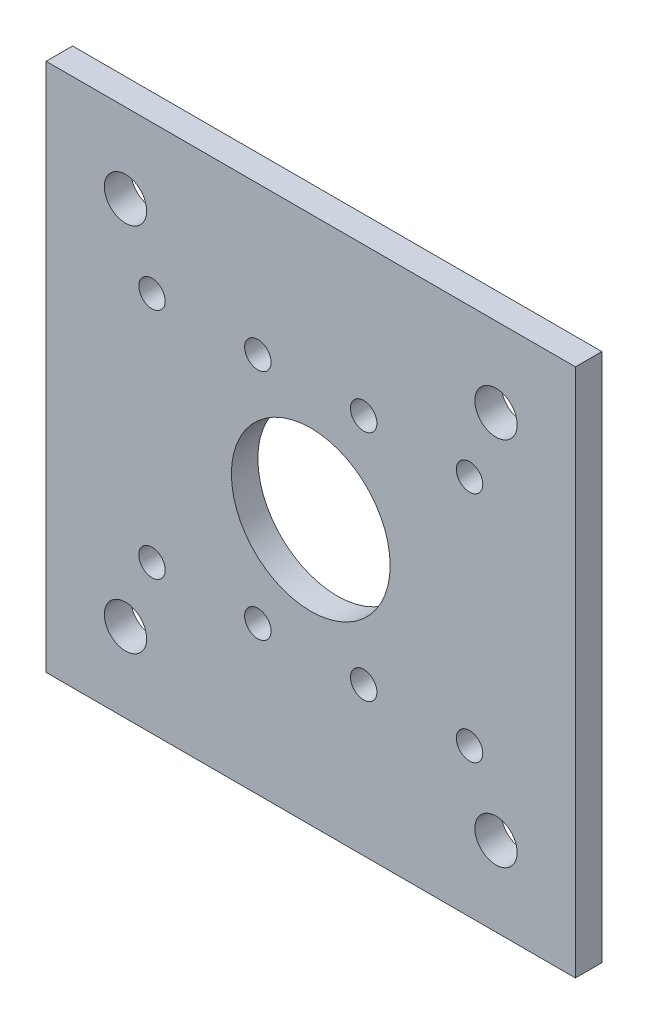
ISO-10303-21;
HEADER;
FILE_DESCRIPTION(('STEP AP214'),'2;1');
FILE_NAME('part.step','',(''),(''),'','','');
FILE_SCHEMA(('AUTOMOTIVE_DESIGN { 1 0 10303 214 1 1 1 1 }'));
ENDSEC;
DATA;
#1=APPLICATION_CONTEXT('core data for automotive mechanical design processes');
#2=APPLICATION_PROTOCOL_DEFINITION('international standard','automotive_design',2000,#1);
#3=PRODUCT_CONTEXT('',#1,'mechanical');
#4=PRODUCT('Part','Part','',(#3));
#5=PRODUCT_RELATED_PRODUCT_CATEGORY('part','',(#4));
#6=PRODUCT_DEFINITION_FORMATION('','',#4);
#7=PRODUCT_DEFINITION_CONTEXT('part definition',#1,'design');
#8=PRODUCT_DEFINITION('design','',#6,#7);
#9=PRODUCT_DEFINITION_SHAPE('','',#8);
#10=(LENGTH_UNIT() NAMED_UNIT(*) SI_UNIT(.MILLI.,.METRE.));
#11=(NAMED_UNIT(*) PLANE_ANGLE_UNIT() SI_UNIT($,.RADIAN.));
#12=(NAMED_UNIT(*) SI_UNIT($,.STERADIAN.) SOLID_ANGLE_UNIT());
#13=UNCERTAINTY_MEASURE_WITH_UNIT(LENGTH_MEASURE(1.E-05),#10,'distance_accuracy_value','');
#14=(GEOMETRIC_REPRESENTATION_CONTEXT(3) GLOBAL_UNCERTAINTY_ASSIGNED_CONTEXT((#13)) GLOBAL_UNIT_ASSIGNED_CONTEXT((#10,
#11,#12)) REPRESENTATION_CONTEXT('',''));
#15=CARTESIAN_POINT('',(0.,0.,0.));
#16=DIRECTION('',(0.,0.,1.));
#17=DIRECTION('',(1.,0.,0.));
#18=AXIS2_PLACEMENT_3D('',#15,#16,#17);
#19=CARTESIAN_POINT('',(0.,0.,5.));
#20=DIRECTION('',(0.,0.,-1.));
#21=DIRECTION('',(-1.,0.,0.));
#22=AXIS2_PLACEMENT_3D('',#19,#20,#21);
#23=PLANE('',#22);
#24=CARTESIAN_POINT('',(40.,72.,5.));
#25=DIRECTION('',(0.,0.,1.));
#26=DIRECTION('',(1.,0.,0.));
#27=AXIS2_PLACEMENT_3D('',#24,#25,#26);
#28=CIRCLE('',#27,2.5);
#29=CARTESIAN_POINT('',(42.5,72.,5.));
#30=VERTEX_POINT('',#29);
#31=EDGE_CURVE('E370',#30,#30,#28,.T.);
#32=ORIENTED_EDGE('',*,*,#31,.F.);
#33=EDGE_LOOP('',(#32));
#34=FACE_BOUND('',#33,.T.);
#35=CARTESIAN_POINT('',(60.,72.,5.));
#36=DIRECTION('',(0.,0.,1.));
#37=DIRECTION('',(1.,0.,0.));
#38=AXIS2_PLACEMENT_3D('',#35,#36,#37);
#39=CIRCLE('',#38,2.5);
#40=CARTESIAN_POINT('',(62.5,72.,5.));
#41=VERTEX_POINT('',#40);
#42=EDGE_CURVE('E371',#41,#41,#39,.T.);
#43=ORIENTED_EDGE('',*,*,#42,.F.);
#44=EDGE_LOOP('',(#43));
#45=FACE_BOUND('',#44,.T.);
#46=CARTESIAN_POINT('',(80.,72.,5.));
#47=DIRECTION('',(0.,0.,1.));
#48=DIRECTION('',(1.,0.,0.));
#49=AXIS2_PLACEMENT_3D('',#46,#47,#48);
#50=CIRCLE('',#49,2.50000000000001);
#51=CARTESIAN_POINT('',(82.5,72.,5.));
#52=VERTEX_POINT('',#51);
#53=EDGE_CURVE('E375',#52,#52,#50,.T.);
#54=ORIENTED_EDGE('',*,*,#53,.F.);
#55=EDGE_LOOP('',(#54));
#56=FACE_BOUND('',#55,.T.);
#57=CARTESIAN_POINT('',(80.,28.,5.));
#58=DIRECTION('',(0.,0.,1.));
#59=DIRECTION('',(1.,0.,0.));
#60=AXIS2_PLACEMENT_3D('',#57,#58,#59);
#61=CIRCLE('',#60,2.50000000000001);
#62=CARTESIAN_POINT('',(82.5,28.,5.));
#63=VERTEX_POINT('',#62);
#64=EDGE_CURVE('E383',#63,#63,#61,.T.);
#65=ORIENTED_EDGE('',*,*,#64,.F.);
#66=EDGE_LOOP('',(#65));
#67=FACE_BOUND('',#66,.T.);
#68=CARTESIAN_POINT('',(60.,28.,5.));
#69=DIRECTION('',(0.,0.,1.));
#70=DIRECTION('',(1.,0.,0.));
#71=AXIS2_PLACEMENT_3D('',#68,#69,#70);
#72=CIRCLE('',#71,2.49999999999999);
#73=CARTESIAN_POINT('',(62.5,28.,5.));
#74=VERTEX_POINT('',#73);
#75=EDGE_CURVE('E385',#74,#74,#72,.T.);
#76=ORIENTED_EDGE('',*,*,#75,.F.);
#77=EDGE_LOOP('',(#76));
#78=FACE_BOUND('',#77,.T.);
#79=CARTESIAN_POINT('',(40.,28.,5.));
#80=DIRECTION('',(0.,0.,1.));
#81=DIRECTION('',(1.,0.,0.));
#82=AXIS2_PLACEMENT_3D('',#79,#80,#81);
#83=CIRCLE('',#82,2.5);
#84=CARTESIAN_POINT('',(42.5,28.,5.));
#85=VERTEX_POINT('',#84);
#86=EDGE_CURVE('E389',#85,#85,#83,.T.);
#87=ORIENTED_EDGE('',*,*,#86,.F.);
#88=EDGE_LOOP('',(#87));
#89=FACE_BOUND('',#88,.T.);
#90=CARTESIAN_POINT('',(20.,28.,5.));
#91=DIRECTION('',(0.,0.,1.));
#92=DIRECTION('',(1.,0.,0.));
#93=AXIS2_PLACEMENT_3D('',#90,#91,#92);
#94=CIRCLE('',#93,2.49999999999999);
#95=CARTESIAN_POINT('',(22.5,28.,5.));
#96=VERTEX_POINT('',#95);
#97=EDGE_CURVE('E378',#96,#96,#94,.T.);
#98=ORIENTED_EDGE('',*,*,#97,.F.);
#99=EDGE_LOOP('',(#98));
#100=FACE_BOUND('',#99,.T.);
#101=CARTESIAN_POINT('',(20.,72.,5.));
#102=DIRECTION('',(0.,0.,1.));
#103=DIRECTION('',(1.,0.,0.));
#104=AXIS2_PLACEMENT_3D('',#101,#102,#103);
#105=CIRCLE('',#104,2.5);
#106=CARTESIAN_POINT('',(22.5,72.,5.));
#107=VERTEX_POINT('',#106);
#108=EDGE_CURVE('E115',#107,#107,#105,.T.);
#109=ORIENTED_EDGE('',*,*,#108,.F.);
#110=EDGE_LOOP('',(#109));
#111=FACE_BOUND('',#110,.T.);
#112=DIRECTION('',(0.,-1.,0.));
#113=VECTOR('',#112,1.);
#114=CARTESIAN_POINT('',(0.,0.,5.));
#115=LINE('',#114,#113);
#116=CARTESIAN_POINT('',(0.,100.,5.));
#117=VERTEX_POINT('',#116);
#118=CARTESIAN_POINT('',(0.,0.,5.));
#119=VERTEX_POINT('',#118);
#120=EDGE_CURVE('E89',#117,#119,#115,.T.);
#121=ORIENTED_EDGE('',*,*,#120,.T.);
#122=DIRECTION('',(1.,0.,0.));
#123=VECTOR('',#122,1.);
#124=CARTESIAN_POINT('',(0.,0.,5.));
#125=LINE('',#124,#123);
#126=CARTESIAN_POINT('',(100.,0.,5.));
#127=VERTEX_POINT('',#126);
#128=EDGE_CURVE('E84',#119,#127,#125,.T.);
#129=ORIENTED_EDGE('',*,*,#128,.T.);
#130=DIRECTION('',(0.,1.,0.));
#131=VECTOR('',#130,1.);
#132=CARTESIAN_POINT('',(100.,0.,5.));
#133=LINE('',#132,#131);
#134=CARTESIAN_POINT('',(100.,100.,5.));
#135=VERTEX_POINT('',#134);
#136=EDGE_CURVE('E87',#127,#135,#133,.T.);
#137=ORIENTED_EDGE('',*,*,#136,.T.);
#138=DIRECTION('',(-1.,0.,0.));
#139=VECTOR('',#138,1.);
#140=CARTESIAN_POINT('',(0.,100.,5.));
#141=LINE('',#140,#139);
#142=EDGE_CURVE('E54',#135,#117,#141,.T.);
#143=ORIENTED_EDGE('',*,*,#142,.T.);
#144=EDGE_LOOP('',(#121,#129,#137,#143));
#145=FACE_BOUND('',#144,.T.);
#146=CARTESIAN_POINT('',(50.,50.,5.));
#147=DIRECTION('',(0.,0.,1.));
#148=DIRECTION('',(1.,0.,0.));
#149=AXIS2_PLACEMENT_3D('',#146,#147,#148);
#150=CIRCLE('',#149,15.);
#151=CARTESIAN_POINT('',(65.,50.,5.));
#152=VERTEX_POINT('',#151);
#153=EDGE_CURVE('E105',#152,#152,#150,.T.);
#154=ORIENTED_EDGE('',*,*,#153,.F.);
#155=EDGE_LOOP('',(#154));
#156=FACE_BOUND('',#155,.T.);
#157=CARTESIAN_POINT('',(15.,85.,5.));
#158=DIRECTION('',(0.,0.,1.));
#159=DIRECTION('',(1.,0.,0.));
#160=AXIS2_PLACEMENT_3D('',#157,#158,#159);
#161=CIRCLE('',#160,4.);
#162=CARTESIAN_POINT('',(19.,85.,5.));
#163=VERTEX_POINT('',#162);
#164=EDGE_CURVE('E159',#163,#163,#161,.T.);
#165=ORIENTED_EDGE('',*,*,#164,.F.);
#166=EDGE_LOOP('',(#165));
#167=FACE_BOUND('',#166,.T.);
#168=CARTESIAN_POINT('',(85.,85.,5.));
#169=DIRECTION('',(0.,0.,1.));
#170=DIRECTION('',(1.,0.,0.));
#171=AXIS2_PLACEMENT_3D('',#168,#169,#170);
#172=CIRCLE('',#171,4.00000000000001);
#173=CARTESIAN_POINT('',(89.,85.,5.));
#174=VERTEX_POINT('',#173);
#175=EDGE_CURVE('E153',#174,#174,#172,.T.);
#176=ORIENTED_EDGE('',*,*,#175,.F.);
#177=EDGE_LOOP('',(#176));
#178=FACE_BOUND('',#177,.T.);
#179=CARTESIAN_POINT('',(85.,15.,5.));
#180=DIRECTION('',(0.,0.,1.));
#181=DIRECTION('',(1.,0.,0.));
#182=AXIS2_PLACEMENT_3D('',#179,#180,#181);
#183=CIRCLE('',#182,4.00000000000001);
#184=CARTESIAN_POINT('',(89.,15.,5.));
#185=VERTEX_POINT('',#184);
#186=EDGE_CURVE('E147',#185,#185,#183,.T.);
#187=ORIENTED_EDGE('',*,*,#186,.F.);
#188=EDGE_LOOP('',(#187));
#189=FACE_BOUND('',#188,.T.);
#190=CARTESIAN_POINT('',(15.,15.,5.));
#191=DIRECTION('',(0.,0.,1.));
#192=DIRECTION('',(1.,0.,0.));
#193=AXIS2_PLACEMENT_3D('',#190,#191,#192);
#194=CIRCLE('',#193,4.);
#195=CARTESIAN_POINT('',(19.,15.,5.));
#196=VERTEX_POINT('',#195);
#197=EDGE_CURVE('E138',#196,#196,#194,.T.);
#198=ORIENTED_EDGE('',*,*,#197,.F.);
#199=EDGE_LOOP('',(#198));
#200=FACE_BOUND('',#199,.T.);
#201=ADVANCED_FACE('F35',(#34,#45,#56,#67,#78,#89,#100,#111,#145,#156,#167,#178,#189,#200),#23,.F.);
#202=CARTESIAN_POINT('',(0.,0.,0.));
#203=DIRECTION('',(0.,0.,-1.));
#204=DIRECTION('',(-1.,0.,0.));
#205=AXIS2_PLACEMENT_3D('',#202,#203,#204);
#206=PLANE('',#205);
#207=CARTESIAN_POINT('',(40.,72.,0.));
#208=DIRECTION('',(0.,0.,-1.));
#209=DIRECTION('',(-1.,0.,0.));
#210=AXIS2_PLACEMENT_3D('',#207,#208,#209);
#211=CIRCLE('',#210,2.5);
#212=CARTESIAN_POINT('',(37.5,72.,0.));
#213=VERTEX_POINT('',#212);
#214=EDGE_CURVE('E39',#213,#213,#211,.T.);
#215=ORIENTED_EDGE('',*,*,#214,.F.);
#216=EDGE_LOOP('',(#215));
#217=FACE_BOUND('',#216,.T.);
#218=CARTESIAN_POINT('',(60.,72.,0.));
#219=DIRECTION('',(0.,0.,-1.));
#220=DIRECTION('',(-1.,0.,0.));
#221=AXIS2_PLACEMENT_3D('',#218,#219,#220);
#222=CIRCLE('',#221,2.5);
#223=CARTESIAN_POINT('',(57.5,72.,0.));
#224=VERTEX_POINT('',#223);
#225=EDGE_CURVE('E129',#224,#224,#222,.T.);
#226=ORIENTED_EDGE('',*,*,#225,.F.);
#227=EDGE_LOOP('',(#226));
#228=FACE_BOUND('',#227,.T.);
#229=CARTESIAN_POINT('',(80.,72.,0.));
#230=DIRECTION('',(0.,0.,-1.));
#231=DIRECTION('',(-1.,0.,0.));
#232=AXIS2_PLACEMENT_3D('',#229,#230,#231);
#233=CIRCLE('',#232,2.50000000000001);
#234=CARTESIAN_POINT('',(77.5,72.,0.));
#235=VERTEX_POINT('',#234);
#236=EDGE_CURVE('E127',#235,#235,#233,.T.);
#237=ORIENTED_EDGE('',*,*,#236,.F.);
#238=EDGE_LOOP('',(#237));
#239=FACE_BOUND('',#238,.T.);
#240=CARTESIAN_POINT('',(80.,28.,0.));
#241=DIRECTION('',(0.,0.,-1.));
#242=DIRECTION('',(-1.,0.,0.));
#243=AXIS2_PLACEMENT_3D('',#240,#241,#242);
#244=CIRCLE('',#243,2.50000000000001);
#245=CARTESIAN_POINT('',(77.5,28.,0.));
#246=VERTEX_POINT('',#245);
#247=EDGE_CURVE('E124',#246,#246,#244,.T.);
#248=ORIENTED_EDGE('',*,*,#247,.F.);
#249=EDGE_LOOP('',(#248));
#250=FACE_BOUND('',#249,.T.);
#251=CARTESIAN_POINT('',(60.,28.,0.));
#252=DIRECTION('',(0.,0.,-1.));
#253=DIRECTION('',(-1.,0.,0.));
#254=AXIS2_PLACEMENT_3D('',#251,#252,#253);
#255=CIRCLE('',#254,2.49999999999999);
#256=CARTESIAN_POINT('',(57.5,28.,0.));
#257=VERTEX_POINT('',#256);
#258=EDGE_CURVE('E121',#257,#257,#255,.T.);
#259=ORIENTED_EDGE('',*,*,#258,.F.);
#260=EDGE_LOOP('',(#259));
#261=FACE_BOUND('',#260,.T.);
#262=CARTESIAN_POINT('',(40.,28.,0.));
#263=DIRECTION('',(0.,0.,-1.));
#264=DIRECTION('',(-1.,0.,0.));
#265=AXIS2_PLACEMENT_3D('',#262,#263,#264);
#266=CIRCLE('',#265,2.5);
#267=CARTESIAN_POINT('',(37.5,28.,0.));
#268=VERTEX_POINT('',#267);
#269=EDGE_CURVE('E118',#268,#268,#266,.T.);
#270=ORIENTED_EDGE('',*,*,#269,.F.);
#271=EDGE_LOOP('',(#270));
#272=FACE_BOUND('',#271,.T.);
#273=CARTESIAN_POINT('',(20.,28.,0.));
#274=DIRECTION('',(0.,0.,-1.));
#275=DIRECTION('',(-1.,0.,0.));
#276=AXIS2_PLACEMENT_3D('',#273,#274,#275);
#277=CIRCLE('',#276,2.49999999999999);
#278=CARTESIAN_POINT('',(17.5,28.,0.));
#279=VERTEX_POINT('',#278);
#280=EDGE_CURVE('E114',#279,#279,#277,.T.);
#281=ORIENTED_EDGE('',*,*,#280,.F.);
#282=EDGE_LOOP('',(#281));
#283=FACE_BOUND('',#282,.T.);
#284=CARTESIAN_POINT('',(20.,72.,0.));
#285=DIRECTION('',(0.,0.,-1.));
#286=DIRECTION('',(-1.,0.,0.));
#287=AXIS2_PLACEMENT_3D('',#284,#285,#286);
#288=CIRCLE('',#287,2.5);
#289=CARTESIAN_POINT('',(17.5,72.,0.));
#290=VERTEX_POINT('',#289);
#291=EDGE_CURVE('E111',#290,#290,#288,.T.);
#292=ORIENTED_EDGE('',*,*,#291,.F.);
#293=EDGE_LOOP('',(#292));
#294=FACE_BOUND('',#293,.T.);
#295=CARTESIAN_POINT('',(85.,15.,0.));
#296=DIRECTION('',(0.,0.,1.));
#297=DIRECTION('',(1.,0.,0.));
#298=AXIS2_PLACEMENT_3D('',#295,#296,#297);
#299=CIRCLE('',#298,4.00000000000001);
#300=CARTESIAN_POINT('',(89.,15.,0.));
#301=VERTEX_POINT('',#300);
#302=EDGE_CURVE('E143',#301,#301,#299,.T.);
#303=ORIENTED_EDGE('',*,*,#302,.T.);
#304=EDGE_LOOP('',(#303));
#305=FACE_BOUND('',#304,.T.);
#306=CARTESIAN_POINT('',(15.,85.,0.));
#307=DIRECTION('',(0.,0.,1.));
#308=DIRECTION('',(1.,0.,0.));
#309=AXIS2_PLACEMENT_3D('',#306,#307,#308);
#310=CIRCLE('',#309,4.);
#311=CARTESIAN_POINT('',(19.,85.,0.));
#312=VERTEX_POINT('',#311);
#313=EDGE_CURVE('E156',#312,#312,#310,.T.);
#314=ORIENTED_EDGE('',*,*,#313,.T.);
#315=EDGE_LOOP('',(#314));
#316=FACE_BOUND('',#315,.T.);
#317=DIRECTION('',(0.,-1.,0.));
#318=VECTOR('',#317,1.);
#319=CARTESIAN_POINT('',(0.,0.,0.));
#320=LINE('',#319,#318);
#321=CARTESIAN_POINT('',(0.,100.,0.));
#322=VERTEX_POINT('',#321);
#323=CARTESIAN_POINT('',(0.,0.,0.));
#324=VERTEX_POINT('',#323);
#325=EDGE_CURVE('E102',#322,#324,#320,.T.);
#326=ORIENTED_EDGE('',*,*,#325,.F.);
#327=DIRECTION('',(-1.,0.,0.));
#328=VECTOR('',#327,1.);
#329=CARTESIAN_POINT('',(0.,100.,0.));
#330=LINE('',#329,#328);
#331=CARTESIAN_POINT('',(100.,100.,0.));
#332=VERTEX_POINT('',#331);
#333=EDGE_CURVE('E77',#332,#322,#330,.T.);
#334=ORIENTED_EDGE('',*,*,#333,.F.);
#335=DIRECTION('',(0.,1.,0.));
#336=VECTOR('',#335,1.);
#337=CARTESIAN_POINT('',(100.,0.,0.));
#338=LINE('',#337,#336);
#339=CARTESIAN_POINT('',(100.,0.,0.));
#340=VERTEX_POINT('',#339);
#341=EDGE_CURVE('E71',#340,#332,#338,.T.);
#342=ORIENTED_EDGE('',*,*,#341,.F.);
#343=DIRECTION('',(1.,0.,0.));
#344=VECTOR('',#343,1.);
#345=CARTESIAN_POINT('',(0.,0.,0.));
#346=LINE('',#345,#344);
#347=EDGE_CURVE('E93',#324,#340,#346,.T.);
#348=ORIENTED_EDGE('',*,*,#347,.F.);
#349=EDGE_LOOP('',(#326,#334,#342,#348));
#350=FACE_BOUND('',#349,.T.);
#351=CARTESIAN_POINT('',(50.,50.,0.));
#352=DIRECTION('',(0.,0.,1.));
#353=DIRECTION('',(1.,0.,0.));
#354=AXIS2_PLACEMENT_3D('',#351,#352,#353);
#355=CIRCLE('',#354,15.);
#356=CARTESIAN_POINT('',(65.,50.,0.));
#357=VERTEX_POINT('',#356);
#358=EDGE_CURVE('E162',#357,#357,#355,.T.);
#359=ORIENTED_EDGE('',*,*,#358,.T.);
#360=EDGE_LOOP('',(#359));
#361=FACE_BOUND('',#360,.T.);
#362=CARTESIAN_POINT('',(85.,85.,0.));
#363=DIRECTION('',(0.,0.,1.));
#364=DIRECTION('',(1.,0.,0.));
#365=AXIS2_PLACEMENT_3D('',#362,#363,#364);
#366=CIRCLE('',#365,4.00000000000001);
#367=CARTESIAN_POINT('',(89.,85.,0.));
#368=VERTEX_POINT('',#367);
#369=EDGE_CURVE('E150',#368,#368,#366,.T.);
#370=ORIENTED_EDGE('',*,*,#369,.T.);
#371=EDGE_LOOP('',(#370));
#372=FACE_BOUND('',#371,.T.);
#373=CARTESIAN_POINT('',(15.,15.,0.));
#374=DIRECTION('',(0.,0.,1.));
#375=DIRECTION('',(1.,0.,0.));
#376=AXIS2_PLACEMENT_3D('',#373,#374,#375);
#377=CIRCLE('',#376,4.);
#378=CARTESIAN_POINT('',(19.,15.,0.));
#379=VERTEX_POINT('',#378);
#380=EDGE_CURVE('E134',#379,#379,#377,.T.);
#381=ORIENTED_EDGE('',*,*,#380,.T.);
#382=EDGE_LOOP('',(#381));
#383=FACE_BOUND('',#382,.T.);
#384=ADVANCED_FACE('F170',(#217,#228,#239,#250,#261,#272,#283,#294,#305,#316,#350,#361,#372,
#383),#206,.T.);
#385=CARTESIAN_POINT('',(0.,0.,5.));
#386=DIRECTION('',(1.,0.,0.));
#387=DIRECTION('',(0.,0.,-1.));
#388=AXIS2_PLACEMENT_3D('',#385,#386,#387);
#389=PLANE('',#388);
#390=ORIENTED_EDGE('',*,*,#325,.T.);
#391=DIRECTION('',(0.,0.,-1.));
#392=VECTOR('',#391,1.);
#393=CARTESIAN_POINT('',(0.,0.,5.));
#394=LINE('',#393,#392);
#395=EDGE_CURVE('E11',#119,#324,#394,.T.);
#396=ORIENTED_EDGE('',*,*,#395,.F.);
#397=ORIENTED_EDGE('',*,*,#120,.F.);
#398=DIRECTION('',(0.,0.,-1.));
#399=VECTOR('',#398,1.);
#400=CARTESIAN_POINT('',(0.,100.,5.));
#401=LINE('',#400,#399);
#402=EDGE_CURVE('E98',#117,#322,#401,.T.);
#403=ORIENTED_EDGE('',*,*,#402,.T.);
#404=EDGE_LOOP('',(#390,#396,#397,#403));
#405=FACE_BOUND('',#404,.T.);
#406=ADVANCED_FACE('F37',(#405),#389,.F.);
#407=CARTESIAN_POINT('',(0.,0.,5.));
#408=DIRECTION('',(0.,1.,0.));
#409=DIRECTION('',(0.,0.,1.));
#410=AXIS2_PLACEMENT_3D('',#407,#408,#409);
#411=PLANE('',#410);
#412=ORIENTED_EDGE('',*,*,#347,.T.);
#413=DIRECTION('',(0.,0.,-1.));
#414=VECTOR('',#413,1.);
#415=CARTESIAN_POINT('',(100.,0.,5.));
#416=LINE('',#415,#414);
#417=EDGE_CURVE('E45',#127,#340,#416,.T.);
#418=ORIENTED_EDGE('',*,*,#417,.F.);
#419=ORIENTED_EDGE('',*,*,#128,.F.);
#420=ORIENTED_EDGE('',*,*,#395,.T.);
#421=EDGE_LOOP('',(#412,#418,#419,#420));
#422=FACE_BOUND('',#421,.T.);
#423=ADVANCED_FACE('F92',(#422),#411,.F.);
#424=CARTESIAN_POINT('',(100.,0.,5.));
#425=DIRECTION('',(-1.,0.,0.));
#426=DIRECTION('',(0.,0.,1.));
#427=AXIS2_PLACEMENT_3D('',#424,#425,#426);
#428=PLANE('',#427);
#429=ORIENTED_EDGE('',*,*,#341,.T.);
#430=DIRECTION('',(0.,0.,-1.));
#431=VECTOR('',#430,1.);
#432=CARTESIAN_POINT('',(100.,100.,5.));
#433=LINE('',#432,#431);
#434=EDGE_CURVE('E94',#135,#332,#433,.T.);
#435=ORIENTED_EDGE('',*,*,#434,.F.);
#436=ORIENTED_EDGE('',*,*,#136,.F.);
#437=ORIENTED_EDGE('',*,*,#417,.T.);
#438=EDGE_LOOP('',(#429,#435,#436,#437));
#439=FACE_BOUND('',#438,.T.);
#440=ADVANCED_FACE('F96',(#439),#428,.F.);
#441=CARTESIAN_POINT('',(0.,100.,5.));
#442=DIRECTION('',(0.,-1.,0.));
#443=DIRECTION('',(0.,0.,-1.));
#444=AXIS2_PLACEMENT_3D('',#441,#442,#443);
#445=PLANE('',#444);
#446=ORIENTED_EDGE('',*,*,#333,.T.);
#447=ORIENTED_EDGE('',*,*,#402,.F.);
#448=ORIENTED_EDGE('',*,*,#142,.F.);
#449=ORIENTED_EDGE('',*,*,#434,.T.);
#450=EDGE_LOOP('',(#446,#447,#448,#449));
#451=FACE_BOUND('',#450,.T.);
#452=ADVANCED_FACE('F176',(#451),#445,.F.);
#453=CARTESIAN_POINT('',(50.,50.,5.));
#454=DIRECTION('',(0.,0.,-1.));
#455=DIRECTION('',(-1.,0.,0.));
#456=AXIS2_PLACEMENT_3D('',#453,#454,#455);
#457=CYLINDRICAL_SURFACE('',#456,15.);
#458=ORIENTED_EDGE('',*,*,#153,.T.);
#459=EDGE_LOOP('',(#458));
#460=FACE_BOUND('',#459,.T.);
#461=ORIENTED_EDGE('',*,*,#358,.F.);
#462=EDGE_LOOP('',(#461));
#463=FACE_BOUND('',#462,.T.);
#464=ADVANCED_FACE('F173',(#460,#463),#457,.F.);
#465=CARTESIAN_POINT('',(15.,85.,5.));
#466=DIRECTION('',(0.,0.,-1.));
#467=DIRECTION('',(-1.,0.,0.));
#468=AXIS2_PLACEMENT_3D('',#465,#466,#467);
#469=CYLINDRICAL_SURFACE('',#468,4.);
#470=ORIENTED_EDGE('',*,*,#164,.T.);
#471=EDGE_LOOP('',(#470));
#472=FACE_BOUND('',#471,.T.);
#473=ORIENTED_EDGE('',*,*,#313,.F.);
#474=EDGE_LOOP('',(#473));
#475=FACE_BOUND('',#474,.T.);
#476=ADVANCED_FACE('F175',(#472,#475),#469,.F.);
#477=CARTESIAN_POINT('',(85.,85.,5.));
#478=DIRECTION('',(0.,0.,-1.));
#479=DIRECTION('',(-1.,0.,0.));
#480=AXIS2_PLACEMENT_3D('',#477,#478,#479);
#481=CYLINDRICAL_SURFACE('',#480,4.00000000000001);
#482=ORIENTED_EDGE('',*,*,#175,.T.);
#483=EDGE_LOOP('',(#482));
#484=FACE_BOUND('',#483,.T.);
#485=ORIENTED_EDGE('',*,*,#369,.F.);
#486=EDGE_LOOP('',(#485));
#487=FACE_BOUND('',#486,.T.);
#488=ADVANCED_FACE('F183',(#484,#487),#481,.F.);
#489=CARTESIAN_POINT('',(85.,15.,5.));
#490=DIRECTION('',(0.,0.,-1.));
#491=DIRECTION('',(-1.,0.,0.));
#492=AXIS2_PLACEMENT_3D('',#489,#490,#491);
#493=CYLINDRICAL_SURFACE('',#492,4.00000000000001);
#494=ORIENTED_EDGE('',*,*,#186,.T.);
#495=EDGE_LOOP('',(#494));
#496=FACE_BOUND('',#495,.T.);
#497=ORIENTED_EDGE('',*,*,#302,.F.);
#498=EDGE_LOOP('',(#497));
#499=FACE_BOUND('',#498,.T.);
#500=ADVANCED_FACE('F303',(#496,#499),#493,.F.);
#501=CARTESIAN_POINT('',(15.,15.,5.));
#502=DIRECTION('',(0.,0.,-1.));
#503=DIRECTION('',(-1.,0.,0.));
#504=AXIS2_PLACEMENT_3D('',#501,#502,#503);
#505=CYLINDRICAL_SURFACE('',#504,4.);
#506=ORIENTED_EDGE('',*,*,#197,.T.);
#507=EDGE_LOOP('',(#506));
#508=FACE_BOUND('',#507,.T.);
#509=ORIENTED_EDGE('',*,*,#380,.F.);
#510=EDGE_LOOP('',(#509));
#511=FACE_BOUND('',#510,.T.);
#512=ADVANCED_FACE('F226',(#508,#511),#505,.F.);
#513=CARTESIAN_POINT('',(20.,72.,-5.));
#514=DIRECTION('',(0.,0.,1.));
#515=DIRECTION('',(1.,0.,0.));
#516=AXIS2_PLACEMENT_3D('',#513,#514,#515);
#517=CYLINDRICAL_SURFACE('',#516,2.5);
#518=ORIENTED_EDGE('',*,*,#291,.T.);
#519=EDGE_LOOP('',(#518));
#520=FACE_BOUND('',#519,.T.);
#521=ORIENTED_EDGE('',*,*,#108,.T.);
#522=EDGE_LOOP('',(#521));
#523=FACE_BOUND('',#522,.T.);
#524=ADVANCED_FACE('F220',(#520,#523),#517,.F.);
#525=CARTESIAN_POINT('',(20.,28.,-5.));
#526=DIRECTION('',(0.,0.,1.));
#527=DIRECTION('',(1.,0.,0.));
#528=AXIS2_PLACEMENT_3D('',#525,#526,#527);
#529=CYLINDRICAL_SURFACE('',#528,2.49999999999999);
#530=ORIENTED_EDGE('',*,*,#280,.T.);
#531=EDGE_LOOP('',(#530));
#532=FACE_BOUND('',#531,.T.);
#533=ORIENTED_EDGE('',*,*,#97,.T.);
#534=EDGE_LOOP('',(#533));
#535=FACE_BOUND('',#534,.T.);
#536=ADVANCED_FACE('F225',(#532,#535),#529,.F.);
#537=CARTESIAN_POINT('',(40.,28.,-5.));
#538=DIRECTION('',(0.,0.,1.));
#539=DIRECTION('',(1.,0.,0.));
#540=AXIS2_PLACEMENT_3D('',#537,#538,#539);
#541=CYLINDRICAL_SURFACE('',#540,2.5);
#542=ORIENTED_EDGE('',*,*,#269,.T.);
#543=EDGE_LOOP('',(#542));
#544=FACE_BOUND('',#543,.T.);
#545=ORIENTED_EDGE('',*,*,#86,.T.);
#546=EDGE_LOOP('',(#545));
#547=FACE_BOUND('',#546,.T.);
#548=ADVANCED_FACE('F238',(#544,#547),#541,.F.);
#549=CARTESIAN_POINT('',(60.,28.,-5.));
#550=DIRECTION('',(0.,0.,1.));
#551=DIRECTION('',(1.,0.,0.));
#552=AXIS2_PLACEMENT_3D('',#549,#550,#551);
#553=CYLINDRICAL_SURFACE('',#552,2.49999999999999);
#554=ORIENTED_EDGE('',*,*,#258,.T.);
#555=EDGE_LOOP('',(#554));
#556=FACE_BOUND('',#555,.T.);
#557=ORIENTED_EDGE('',*,*,#75,.T.);
#558=EDGE_LOOP('',(#557));
#559=FACE_BOUND('',#558,.T.);
#560=ADVANCED_FACE('F248',(#556,#559),#553,.F.);
#561=CARTESIAN_POINT('',(80.,28.,-5.));
#562=DIRECTION('',(0.,0.,1.));
#563=DIRECTION('',(1.,0.,0.));
#564=AXIS2_PLACEMENT_3D('',#561,#562,#563);
#565=CYLINDRICAL_SURFACE('',#564,2.50000000000001);
#566=ORIENTED_EDGE('',*,*,#247,.T.);
#567=EDGE_LOOP('',(#566));
#568=FACE_BOUND('',#567,.T.);
#569=ORIENTED_EDGE('',*,*,#64,.T.);
#570=EDGE_LOOP('',(#569));
#571=FACE_BOUND('',#570,.T.);
#572=ADVANCED_FACE('F258',(#568,#571),#565,.F.);
#573=CARTESIAN_POINT('',(80.,72.,-5.));
#574=DIRECTION('',(0.,0.,1.));
#575=DIRECTION('',(1.,0.,0.));
#576=AXIS2_PLACEMENT_3D('',#573,#574,#575);
#577=CYLINDRICAL_SURFACE('',#576,2.50000000000001);
#578=ORIENTED_EDGE('',*,*,#236,.T.);
#579=EDGE_LOOP('',(#578));
#580=FACE_BOUND('',#579,.T.);
#581=ORIENTED_EDGE('',*,*,#53,.T.);
#582=EDGE_LOOP('',(#581));
#583=FACE_BOUND('',#582,.T.);
#584=ADVANCED_FACE('F268',(#580,#583),#577,.F.);
#585=CARTESIAN_POINT('',(60.,72.,-5.));
#586=DIRECTION('',(0.,0.,1.));
#587=DIRECTION('',(1.,0.,0.));
#588=AXIS2_PLACEMENT_3D('',#585,#586,#587);
#589=CYLINDRICAL_SURFACE('',#588,2.5);
#590=ORIENTED_EDGE('',*,*,#225,.T.);
#591=EDGE_LOOP('',(#590));
#592=FACE_BOUND('',#591,.T.);
#593=ORIENTED_EDGE('',*,*,#42,.T.);
#594=EDGE_LOOP('',(#593));
#595=FACE_BOUND('',#594,.T.);
#596=ADVANCED_FACE('F278',(#592,#595),#589,.F.);
#597=CARTESIAN_POINT('',(40.,72.,-5.));
#598=DIRECTION('',(0.,0.,1.));
#599=DIRECTION('',(1.,0.,0.));
#600=AXIS2_PLACEMENT_3D('',#597,#598,#599);
#601=CYLINDRICAL_SURFACE('',#600,2.5);
#602=ORIENTED_EDGE('',*,*,#214,.T.);
#603=EDGE_LOOP('',(#602));
#604=FACE_BOUND('',#603,.T.);
#605=ORIENTED_EDGE('',*,*,#31,.T.);
#606=EDGE_LOOP('',(#605));
#607=FACE_BOUND('',#606,.T.);
#608=ADVANCED_FACE('F288',(#604,#607),#601,.F.);
#609=CLOSED_SHELL('',(#201,#384,#406,#423,#440,#452,#464,#476,#488,#500,#512,#524,#536,#548,
#560,#572,#584,#596,#608));
#610=MANIFOLD_SOLID_BREP('B2',#609);
#611=ADVANCED_BREP_SHAPE_REPRESENTATION('',(#18,#610),#14);
#612=SHAPE_DEFINITION_REPRESENTATION(#9,#611);
ENDSEC;
END-ISO-10303-21;
